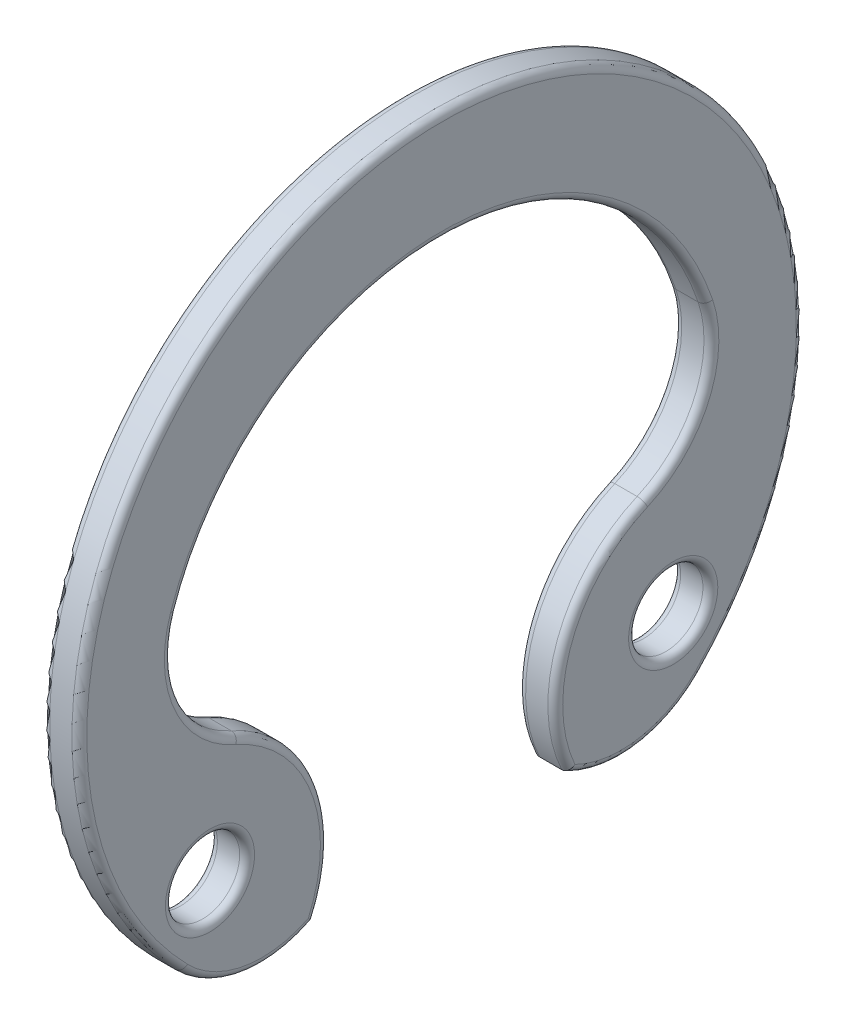
ISO-10303-21;
HEADER;
FILE_DESCRIPTION(('STEP AP214'),'2;1');
FILE_NAME('part.step','',(''),(''),'','','');
FILE_SCHEMA(('AUTOMOTIVE_DESIGN { 1 0 10303 214 1 1 1 1 }'));
ENDSEC;
DATA;
#1=APPLICATION_CONTEXT('core data for automotive mechanical design processes');
#2=APPLICATION_PROTOCOL_DEFINITION('international standard','automotive_design',2000,#1);
#3=PRODUCT_CONTEXT('',#1,'mechanical');
#4=PRODUCT('Part','Part','',(#3));
#5=PRODUCT_RELATED_PRODUCT_CATEGORY('part','',(#4));
#6=PRODUCT_DEFINITION_FORMATION('','',#4);
#7=PRODUCT_DEFINITION_CONTEXT('part definition',#1,'design');
#8=PRODUCT_DEFINITION('design','',#6,#7);
#9=PRODUCT_DEFINITION_SHAPE('','',#8);
#10=(LENGTH_UNIT() NAMED_UNIT(*) SI_UNIT(.MILLI.,.METRE.));
#11=(NAMED_UNIT(*) PLANE_ANGLE_UNIT() SI_UNIT($,.RADIAN.));
#12=(NAMED_UNIT(*) SI_UNIT($,.STERADIAN.) SOLID_ANGLE_UNIT());
#13=UNCERTAINTY_MEASURE_WITH_UNIT(LENGTH_MEASURE(1.E-05),#10,'distance_accuracy_value','');
#14=(GEOMETRIC_REPRESENTATION_CONTEXT(3) GLOBAL_UNCERTAINTY_ASSIGNED_CONTEXT((#13)) GLOBAL_UNIT_ASSIGNED_CONTEXT((#10,
#11,#12)) REPRESENTATION_CONTEXT('',''));
#15=CARTESIAN_POINT('',(0.,0.,0.));
#16=DIRECTION('',(0.,0.,1.));
#17=DIRECTION('',(1.,0.,0.));
#18=AXIS2_PLACEMENT_3D('',#15,#16,#17);
#19=CARTESIAN_POINT('',(1.,-5.67652113609833,-7.06051695329135));
#20=DIRECTION('',(1.,0.,0.));
#21=DIRECTION('',(0.,0.,-1.));
#22=AXIS2_PLACEMENT_3D('',#19,#20,#21);
#23=PLANE('',#22);
#24=CARTESIAN_POINT('',(1.,-5.0126801848678,6.23482456563404));
#25=DIRECTION('',(1.,0.,0.));
#26=DIRECTION('',(0.,0.,-1.));
#27=AXIS2_PLACEMENT_3D('',#24,#25,#26);
#28=CIRCLE('',#27,1.2);
#29=CARTESIAN_POINT('',(1.,-5.0126801848678,5.03482456563404));
#30=VERTEX_POINT('',#29);
#31=EDGE_CURVE('E11',#30,#30,#28,.F.);
#32=ORIENTED_EDGE('',*,*,#31,.T.);
#33=EDGE_LOOP('',(#32));
#34=FACE_BOUND('',#33,.T.);
#35=CARTESIAN_POINT('',(1.,-0.699999999999999,0.));
#36=DIRECTION('',(1.,0.,0.));
#37=DIRECTION('',(0.,0.,-1.));
#38=AXIS2_PLACEMENT_3D('',#35,#36,#37);
#39=CIRCLE('',#38,7.7);
#40=CARTESIAN_POINT('',(1.,1.76449689096355,7.29494722903675));
#41=VERTEX_POINT('',#40);
#42=CARTESIAN_POINT('',(1.,1.76449689096355,-7.29494722903675));
#43=VERTEX_POINT('',#42);
#44=EDGE_CURVE('E61',#41,#43,#39,.F.);
#45=ORIENTED_EDGE('',*,*,#44,.T.);
#46=CARTESIAN_POINT('',(1.,0.740290390822855,-4.26328084813836));
#47=DIRECTION('',(1.,0.,0.));
#48=DIRECTION('',(0.,0.,-1.));
#49=AXIS2_PLACEMENT_3D('',#46,#47,#48);
#50=CIRCLE('',#49,3.2);
#51=CARTESIAN_POINT('',(1.,-2.19310916434111,-5.54201735335115));
#52=VERTEX_POINT('',#51);
#53=EDGE_CURVE('E53',#43,#52,#50,.F.);
#54=ORIENTED_EDGE('',*,*,#53,.T.);
#55=CARTESIAN_POINT('',(1.,-5.67652113609833,-7.06051695329135));
#56=DIRECTION('',(1.,0.,0.));
#57=DIRECTION('',(0.,0.,-1.));
#58=AXIS2_PLACEMENT_3D('',#55,#56,#57);
#59=CIRCLE('',#58,3.8);
#60=CARTESIAN_POINT('',(1.,-7.22066179748076,-3.58839517866053));
#61=VERTEX_POINT('',#60);
#62=EDGE_CURVE('E243',#52,#61,#59,.T.);
#63=ORIENTED_EDGE('',*,*,#62,.T.);
#64=CARTESIAN_POINT('',(1.,-4.71238346623247,-4.83279857506795));
#65=DIRECTION('',(1.,0.,0.));
#66=DIRECTION('',(0.,0.,-1.));
#67=AXIS2_PLACEMENT_3D('',#64,#65,#66);
#68=CIRCLE('',#67,2.8);
#69=CARTESIAN_POINT('',(1.,-6.66714994111409,-6.83751502102206));
#70=VERTEX_POINT('',#69);
#71=EDGE_CURVE('E245',#61,#70,#68,.T.);
#72=ORIENTED_EDGE('',*,*,#71,.T.);
#73=CARTESIAN_POINT('',(1.,0.,0.));
#74=DIRECTION('',(1.,0.,0.));
#75=DIRECTION('',(0.,0.,-1.));
#76=AXIS2_PLACEMENT_3D('',#73,#74,#75);
#77=CIRCLE('',#76,9.55);
#78=CARTESIAN_POINT('',(1.,-6.66714994111409,6.83751502102206));
#79=VERTEX_POINT('',#78);
#80=EDGE_CURVE('E247',#70,#79,#77,.T.);
#81=ORIENTED_EDGE('',*,*,#80,.T.);
#82=CARTESIAN_POINT('',(1.,-4.71238346623247,4.83279857506795));
#83=DIRECTION('',(1.,0.,0.));
#84=DIRECTION('',(0.,0.,-1.));
#85=AXIS2_PLACEMENT_3D('',#82,#83,#84);
#86=CIRCLE('',#85,2.8);
#87=CARTESIAN_POINT('',(1.,-7.22066179748076,3.58839517866053));
#88=VERTEX_POINT('',#87);
#89=EDGE_CURVE('E249',#79,#88,#86,.T.);
#90=ORIENTED_EDGE('',*,*,#89,.T.);
#91=CARTESIAN_POINT('',(1.,-5.67652113609833,7.06051695329135));
#92=DIRECTION('',(1.,0.,0.));
#93=DIRECTION('',(0.,0.,-1.));
#94=AXIS2_PLACEMENT_3D('',#91,#92,#93);
#95=CIRCLE('',#94,3.8);
#96=CARTESIAN_POINT('',(1.,-2.19310916434111,5.54201735335115));
#97=VERTEX_POINT('',#96);
#98=EDGE_CURVE('E251',#88,#97,#95,.T.);
#99=ORIENTED_EDGE('',*,*,#98,.T.);
#100=CARTESIAN_POINT('',(1.,0.740290390822855,4.26328084813836));
#101=DIRECTION('',(1.,0.,0.));
#102=DIRECTION('',(0.,0.,-1.));
#103=AXIS2_PLACEMENT_3D('',#100,#101,#102);
#104=CIRCLE('',#103,3.2);
#105=EDGE_CURVE('E66',#97,#41,#104,.F.);
#106=ORIENTED_EDGE('',*,*,#105,.T.);
#107=EDGE_LOOP('',(#45,#54,#63,#72,#81,#90,#99,#106));
#108=FACE_BOUND('',#107,.T.);
#109=CARTESIAN_POINT('',(1.,-5.0126801848678,-6.23482456563404));
#110=DIRECTION('',(1.,0.,0.));
#111=DIRECTION('',(0.,0.,-1.));
#112=AXIS2_PLACEMENT_3D('',#109,#110,#111);
#113=CIRCLE('',#112,1.2);
#114=CARTESIAN_POINT('',(1.,-5.0126801848678,-7.43482456563404));
#115=VERTEX_POINT('',#114);
#116=EDGE_CURVE('E240',#115,#115,#113,.F.);
#117=ORIENTED_EDGE('',*,*,#116,.T.);
#118=EDGE_LOOP('',(#117));
#119=FACE_BOUND('',#118,.T.);
#120=ADVANCED_FACE('F39',(#34,#108,#119),#23,.T.);
#121=CARTESIAN_POINT('',(0.,-5.67652113609833,-7.06051695329135));
#122=DIRECTION('',(1.,0.,0.));
#123=DIRECTION('',(0.,0.,-1.));
#124=AXIS2_PLACEMENT_3D('',#121,#122,#123);
#125=PLANE('',#124);
#126=CARTESIAN_POINT('',(0.,-5.0126801848678,6.23482456563404));
#127=DIRECTION('',(1.,0.,0.));
#128=DIRECTION('',(0.,0.,-1.));
#129=AXIS2_PLACEMENT_3D('',#126,#127,#128);
#130=CIRCLE('',#129,1.2);
#131=CARTESIAN_POINT('',(0.,-5.0126801848678,5.03482456563404));
#132=VERTEX_POINT('',#131);
#133=EDGE_CURVE('E188',#132,#132,#130,.T.);
#134=ORIENTED_EDGE('',*,*,#133,.T.);
#135=EDGE_LOOP('',(#134));
#136=FACE_BOUND('',#135,.T.);
#137=CARTESIAN_POINT('',(0.,-5.0126801848678,-6.23482456563404));
#138=DIRECTION('',(1.,0.,0.));
#139=DIRECTION('',(0.,0.,-1.));
#140=AXIS2_PLACEMENT_3D('',#137,#138,#139);
#141=CIRCLE('',#140,1.2);
#142=CARTESIAN_POINT('',(0.,-5.0126801848678,-7.43482456563404));
#143=VERTEX_POINT('',#142);
#144=EDGE_CURVE('E185',#143,#143,#141,.T.);
#145=ORIENTED_EDGE('',*,*,#144,.T.);
#146=EDGE_LOOP('',(#145));
#147=FACE_BOUND('',#146,.T.);
#148=CARTESIAN_POINT('',(0.,-5.67652113609833,7.06051695329135));
#149=DIRECTION('',(1.,0.,0.));
#150=DIRECTION('',(0.,0.,-1.));
#151=AXIS2_PLACEMENT_3D('',#148,#149,#150);
#152=CIRCLE('',#151,3.8);
#153=CARTESIAN_POINT('',(0.,-2.19310916434111,5.54201735335115));
#154=VERTEX_POINT('',#153);
#155=CARTESIAN_POINT('',(0.,-7.22066179748076,3.58839517866053));
#156=VERTEX_POINT('',#155);
#157=EDGE_CURVE('E183',#154,#156,#152,.F.);
#158=ORIENTED_EDGE('',*,*,#157,.T.);
#159=CARTESIAN_POINT('',(0.,-4.71238346623247,4.83279857506795));
#160=DIRECTION('',(1.,0.,0.));
#161=DIRECTION('',(0.,0.,-1.));
#162=AXIS2_PLACEMENT_3D('',#159,#160,#161);
#163=CIRCLE('',#162,2.8);
#164=CARTESIAN_POINT('',(0.,-6.66714994111409,6.83751502102206));
#165=VERTEX_POINT('',#164);
#166=EDGE_CURVE('E164',#156,#165,#163,.F.);
#167=ORIENTED_EDGE('',*,*,#166,.T.);
#168=CARTESIAN_POINT('',(0.,0.,0.));
#169=DIRECTION('',(1.,0.,0.));
#170=DIRECTION('',(0.,0.,-1.));
#171=AXIS2_PLACEMENT_3D('',#168,#169,#170);
#172=CIRCLE('',#171,9.55);
#173=CARTESIAN_POINT('',(0.,-6.66714994111409,-6.83751502102206));
#174=VERTEX_POINT('',#173);
#175=EDGE_CURVE('E172',#165,#174,#172,.F.);
#176=ORIENTED_EDGE('',*,*,#175,.T.);
#177=CARTESIAN_POINT('',(0.,-4.71238346623247,-4.83279857506795));
#178=DIRECTION('',(1.,0.,0.));
#179=DIRECTION('',(0.,0.,-1.));
#180=AXIS2_PLACEMENT_3D('',#177,#178,#179);
#181=CIRCLE('',#180,2.8);
#182=CARTESIAN_POINT('',(0.,-7.22066179748076,-3.58839517866053));
#183=VERTEX_POINT('',#182);
#184=EDGE_CURVE('E178',#174,#183,#181,.F.);
#185=ORIENTED_EDGE('',*,*,#184,.T.);
#186=CARTESIAN_POINT('',(0.,-5.67652113609833,-7.06051695329135));
#187=DIRECTION('',(1.,0.,0.));
#188=DIRECTION('',(0.,0.,-1.));
#189=AXIS2_PLACEMENT_3D('',#186,#187,#188);
#190=CIRCLE('',#189,3.8);
#191=CARTESIAN_POINT('',(0.,-2.19310916434111,-5.54201735335115));
#192=VERTEX_POINT('',#191);
#193=EDGE_CURVE('E487',#183,#192,#190,.F.);
#194=ORIENTED_EDGE('',*,*,#193,.T.);
#195=CARTESIAN_POINT('',(0.,0.740290390822855,-4.26328084813836));
#196=DIRECTION('',(1.,0.,0.));
#197=DIRECTION('',(0.,0.,-1.));
#198=AXIS2_PLACEMENT_3D('',#195,#196,#197);
#199=CIRCLE('',#198,3.2);
#200=CARTESIAN_POINT('',(0.,1.76449689096355,-7.29494722903675));
#201=VERTEX_POINT('',#200);
#202=EDGE_CURVE('E462',#192,#201,#199,.T.);
#203=ORIENTED_EDGE('',*,*,#202,.T.);
#204=CARTESIAN_POINT('',(0.,-0.699999999999999,0.));
#205=DIRECTION('',(1.,0.,0.));
#206=DIRECTION('',(0.,0.,-1.));
#207=AXIS2_PLACEMENT_3D('',#204,#205,#206);
#208=CIRCLE('',#207,7.7);
#209=CARTESIAN_POINT('',(0.,1.76449689096355,7.29494722903675));
#210=VERTEX_POINT('',#209);
#211=EDGE_CURVE('E445',#201,#210,#208,.T.);
#212=ORIENTED_EDGE('',*,*,#211,.T.);
#213=CARTESIAN_POINT('',(0.,0.740290390822855,4.26328084813836));
#214=DIRECTION('',(1.,0.,0.));
#215=DIRECTION('',(0.,0.,-1.));
#216=AXIS2_PLACEMENT_3D('',#213,#214,#215);
#217=CIRCLE('',#216,3.2);
#218=EDGE_CURVE('E190',#210,#154,#217,.T.);
#219=ORIENTED_EDGE('',*,*,#218,.T.);
#220=EDGE_LOOP('',(#158,#167,#176,#185,#194,#203,#212,#219));
#221=FACE_BOUND('',#220,.T.);
#222=ADVANCED_FACE('F181',(#136,#147,#221),#125,.F.);
#223=CARTESIAN_POINT('',(1.,-5.67652113609833,-7.06051695329135));
#224=DIRECTION('',(-1.,0.,0.));
#225=DIRECTION('',(0.,0.,1.));
#226=AXIS2_PLACEMENT_3D('',#223,#224,#225);
#227=CYLINDRICAL_SURFACE('',#226,4.);
#228=DIRECTION('',(-1.,0.,0.));
#229=VECTOR('',#228,1.);
#230=CARTESIAN_POINT('',(1.,-2.00977169214337,-5.46209632177536));
#231=LINE('',#230,#229);
#232=CARTESIAN_POINT('',(0.8,-2.00977169214337,-5.46209632177536));
#233=VERTEX_POINT('',#232);
#234=CARTESIAN_POINT('',(0.2,-2.00977169214337,-5.46209632177536));
#235=VERTEX_POINT('',#234);
#236=EDGE_CURVE('E179',#233,#235,#231,.T.);
#237=ORIENTED_EDGE('',*,*,#236,.T.);
#238=CARTESIAN_POINT('',(0.2,-5.67652113609833,-7.06051695329135));
#239=DIRECTION('',(1.,0.,0.));
#240=DIRECTION('',(0.,0.,-1.));
#241=AXIS2_PLACEMENT_3D('',#238,#239,#240);
#242=CIRCLE('',#241,4.);
#243=CARTESIAN_POINT('',(0.2,-7.36699418306113,-3.43528580514475));
#244=VERTEX_POINT('',#243);
#245=EDGE_CURVE('E230',#235,#244,#242,.T.);
#246=ORIENTED_EDGE('',*,*,#245,.T.);
#247=DIRECTION('',(-1.,0.,0.));
#248=VECTOR('',#247,1.);
#249=CARTESIAN_POINT('',(1.,-7.36699418306113,-3.43528580514475));
#250=LINE('',#249,#248);
#251=CARTESIAN_POINT('',(0.8,-7.36699418306113,-3.43528580514475));
#252=VERTEX_POINT('',#251);
#253=EDGE_CURVE('E468',#252,#244,#250,.T.);
#254=ORIENTED_EDGE('',*,*,#253,.F.);
#255=CARTESIAN_POINT('',(0.8,-5.67652113609833,-7.06051695329135));
#256=DIRECTION('',(1.,0.,0.));
#257=DIRECTION('',(0.,0.,-1.));
#258=AXIS2_PLACEMENT_3D('',#255,#256,#257);
#259=CIRCLE('',#258,4.);
#260=EDGE_CURVE('E228',#252,#233,#259,.F.);
#261=ORIENTED_EDGE('',*,*,#260,.T.);
#262=EDGE_LOOP('',(#237,#246,#254,#261));
#263=FACE_BOUND('',#262,.T.);
#264=ADVANCED_FACE('F352',(#263),#227,.T.);
#265=CARTESIAN_POINT('',(1.,0.,0.));
#266=DIRECTION('',(-1.,0.,0.));
#267=DIRECTION('',(0.,0.,1.));
#268=AXIS2_PLACEMENT_3D('',#265,#266,#267);
#269=CYLINDRICAL_SURFACE('',#268,9.75);
#270=DIRECTION('',(-1.,0.,0.));
#271=VECTOR('',#270,1.);
#272=CARTESIAN_POINT('',(1.,-6.80677611789135,-6.98070905287593));
#273=LINE('',#272,#271);
#274=CARTESIAN_POINT('',(0.8,-6.80677611789135,-6.98070905287593));
#275=VERTEX_POINT('',#274);
#276=CARTESIAN_POINT('',(0.2,-6.80677611789135,-6.98070905287593));
#277=VERTEX_POINT('',#276);
#278=EDGE_CURVE('E457',#275,#277,#273,.T.);
#279=ORIENTED_EDGE('',*,*,#278,.T.);
#280=CARTESIAN_POINT('',(0.2,0.,0.));
#281=DIRECTION('',(1.,0.,0.));
#282=DIRECTION('',(0.,0.,-1.));
#283=AXIS2_PLACEMENT_3D('',#280,#281,#282);
#284=CIRCLE('',#283,9.75);
#285=CARTESIAN_POINT('',(0.2,-6.80677611789135,6.98070905287593));
#286=VERTEX_POINT('',#285);
#287=EDGE_CURVE('E238',#277,#286,#284,.T.);
#288=ORIENTED_EDGE('',*,*,#287,.T.);
#289=DIRECTION('',(-1.,0.,0.));
#290=VECTOR('',#289,1.);
#291=CARTESIAN_POINT('',(1.,-6.80677611789135,6.98070905287593));
#292=LINE('',#291,#290);
#293=CARTESIAN_POINT('',(0.8,-6.80677611789135,6.98070905287593));
#294=VERTEX_POINT('',#293);
#295=EDGE_CURVE('E473',#286,#294,#292,.F.);
#296=ORIENTED_EDGE('',*,*,#295,.T.);
#297=CARTESIAN_POINT('',(0.8,0.,0.));
#298=DIRECTION('',(1.,0.,0.));
#299=DIRECTION('',(0.,0.,-1.));
#300=AXIS2_PLACEMENT_3D('',#297,#298,#299);
#301=CIRCLE('',#300,9.75);
#302=EDGE_CURVE('E236',#294,#275,#301,.F.);
#303=ORIENTED_EDGE('',*,*,#302,.T.);
#304=EDGE_LOOP('',(#279,#288,#296,#303));
#305=FACE_BOUND('',#304,.T.);
#306=ADVANCED_FACE('F366',(#305),#269,.T.);
#307=CARTESIAN_POINT('',(1.,-5.67652113609833,7.06051695329135));
#308=DIRECTION('',(-1.,0.,0.));
#309=DIRECTION('',(0.,0.,1.));
#310=AXIS2_PLACEMENT_3D('',#307,#308,#309);
#311=CYLINDRICAL_SURFACE('',#310,4.);
#312=DIRECTION('',(-1.,0.,0.));
#313=VECTOR('',#312,1.);
#314=CARTESIAN_POINT('',(1.,-7.36699418306113,3.43528580514475));
#315=LINE('',#314,#313);
#316=CARTESIAN_POINT('',(0.8,-7.36699418306113,3.43528580514475));
#317=VERTEX_POINT('',#316);
#318=CARTESIAN_POINT('',(0.2,-7.36699418306113,3.43528580514475));
#319=VERTEX_POINT('',#318);
#320=EDGE_CURVE('E300',#317,#319,#315,.T.);
#321=ORIENTED_EDGE('',*,*,#320,.T.);
#322=CARTESIAN_POINT('',(0.2,-5.67652113609833,7.06051695329135));
#323=DIRECTION('',(1.,0.,0.));
#324=DIRECTION('',(0.,0.,-1.));
#325=AXIS2_PLACEMENT_3D('',#322,#323,#324);
#326=CIRCLE('',#325,4.);
#327=CARTESIAN_POINT('',(0.2,-2.00977169214337,5.46209632177535));
#328=VERTEX_POINT('',#327);
#329=EDGE_CURVE('E213',#319,#328,#326,.T.);
#330=ORIENTED_EDGE('',*,*,#329,.T.);
#331=DIRECTION('',(-1.,0.,0.));
#332=VECTOR('',#331,1.);
#333=CARTESIAN_POINT('',(1.,-2.00977169214337,5.46209632177535));
#334=LINE('',#333,#332);
#335=CARTESIAN_POINT('',(0.8,-2.00977169214337,5.46209632177535));
#336=VERTEX_POINT('',#335);
#337=EDGE_CURVE('E482',#328,#336,#334,.F.);
#338=ORIENTED_EDGE('',*,*,#337,.T.);
#339=CARTESIAN_POINT('',(0.8,-5.67652113609833,7.06051695329135));
#340=DIRECTION('',(1.,0.,0.));
#341=DIRECTION('',(0.,0.,-1.));
#342=AXIS2_PLACEMENT_3D('',#339,#340,#341);
#343=CIRCLE('',#342,4.);
#344=EDGE_CURVE('E211',#336,#317,#343,.F.);
#345=ORIENTED_EDGE('',*,*,#344,.T.);
#346=EDGE_LOOP('',(#321,#330,#338,#345));
#347=FACE_BOUND('',#346,.T.);
#348=ADVANCED_FACE('F362',(#347),#311,.T.);
#349=CARTESIAN_POINT('',(1.,-0.699999999999999,0.));
#350=DIRECTION('',(-1.,0.,0.));
#351=DIRECTION('',(0.,0.,1.));
#352=AXIS2_PLACEMENT_3D('',#349,#350,#351);
#353=CYLINDRICAL_SURFACE('',#352,7.5);
#354=DIRECTION('',(-1.,0.,0.));
#355=VECTOR('',#354,1.);
#356=CARTESIAN_POINT('',(1.,1.70048398470476,7.1054680802306));
#357=LINE('',#356,#355);
#358=CARTESIAN_POINT('',(0.8,1.70048398470476,7.1054680802306));
#359=VERTEX_POINT('',#358);
#360=CARTESIAN_POINT('',(0.2,1.70048398470476,7.1054680802306));
#361=VERTEX_POINT('',#360);
#362=EDGE_CURVE('E452',#359,#361,#357,.T.);
#363=ORIENTED_EDGE('',*,*,#362,.T.);
#364=CARTESIAN_POINT('',(0.2,-0.699999999999999,0.));
#365=DIRECTION('',(1.,0.,0.));
#366=DIRECTION('',(0.,0.,-1.));
#367=AXIS2_PLACEMENT_3D('',#364,#365,#366);
#368=CIRCLE('',#367,7.5);
#369=CARTESIAN_POINT('',(0.2,1.70048398470476,-7.1054680802306));
#370=VERTEX_POINT('',#369);
#371=EDGE_CURVE('E221',#361,#370,#368,.F.);
#372=ORIENTED_EDGE('',*,*,#371,.T.);
#373=DIRECTION('',(-1.,0.,0.));
#374=VECTOR('',#373,1.);
#375=CARTESIAN_POINT('',(1.,1.70048398470476,-7.1054680802306));
#376=LINE('',#375,#374);
#377=CARTESIAN_POINT('',(0.8,1.70048398470476,-7.1054680802306));
#378=VERTEX_POINT('',#377);
#379=EDGE_CURVE('E450',#370,#378,#376,.F.);
#380=ORIENTED_EDGE('',*,*,#379,.T.);
#381=CARTESIAN_POINT('',(0.8,-0.699999999999999,0.));
#382=DIRECTION('',(1.,0.,0.));
#383=DIRECTION('',(0.,0.,-1.));
#384=AXIS2_PLACEMENT_3D('',#381,#382,#383);
#385=CIRCLE('',#384,7.5);
#386=EDGE_CURVE('E219',#378,#359,#385,.T.);
#387=ORIENTED_EDGE('',*,*,#386,.T.);
#388=EDGE_LOOP('',(#363,#372,#380,#387));
#389=FACE_BOUND('',#388,.T.);
#390=ADVANCED_FACE('F359',(#389),#353,.F.);
#391=CARTESIAN_POINT('',(1.,-5.0126801848678,-6.23482456563404));
#392=DIRECTION('',(-1.,0.,0.));
#393=DIRECTION('',(0.,0.,1.));
#394=AXIS2_PLACEMENT_3D('',#391,#392,#393);
#395=CYLINDRICAL_SURFACE('',#394,1.);
#396=CARTESIAN_POINT('',(0.2,-5.0126801848678,-6.23482456563404));
#397=DIRECTION('',(1.,0.,0.));
#398=DIRECTION('',(0.,0.,-1.));
#399=AXIS2_PLACEMENT_3D('',#396,#397,#398);
#400=CIRCLE('',#399,1.);
#401=CARTESIAN_POINT('',(0.2,-5.0126801848678,-7.23482456563404));
#402=VERTEX_POINT('',#401);
#403=EDGE_CURVE('E205',#402,#402,#400,.F.);
#404=ORIENTED_EDGE('',*,*,#403,.T.);
#405=EDGE_LOOP('',(#404));
#406=FACE_BOUND('',#405,.T.);
#407=CARTESIAN_POINT('',(0.8,-5.0126801848678,-6.23482456563404));
#408=DIRECTION('',(1.,0.,0.));
#409=DIRECTION('',(0.,0.,-1.));
#410=AXIS2_PLACEMENT_3D('',#407,#408,#409);
#411=CIRCLE('',#410,1.);
#412=CARTESIAN_POINT('',(0.8,-5.0126801848678,-7.23482456563404));
#413=VERTEX_POINT('',#412);
#414=EDGE_CURVE('E202',#413,#413,#411,.T.);
#415=ORIENTED_EDGE('',*,*,#414,.T.);
#416=EDGE_LOOP('',(#415));
#417=FACE_BOUND('',#416,.T.);
#418=ADVANCED_FACE('F356',(#406,#417),#395,.F.);
#419=CARTESIAN_POINT('',(1.,-5.0126801848678,6.23482456563404));
#420=DIRECTION('',(-1.,0.,0.));
#421=DIRECTION('',(0.,0.,1.));
#422=AXIS2_PLACEMENT_3D('',#419,#420,#421);
#423=CYLINDRICAL_SURFACE('',#422,1.);
#424=CARTESIAN_POINT('',(0.2,-5.0126801848678,6.23482456563404));
#425=DIRECTION('',(1.,0.,0.));
#426=DIRECTION('',(0.,0.,-1.));
#427=AXIS2_PLACEMENT_3D('',#424,#425,#426);
#428=CIRCLE('',#427,1.);
#429=CARTESIAN_POINT('',(0.2,-5.0126801848678,5.23482456563404));
#430=VERTEX_POINT('',#429);
#431=EDGE_CURVE('E199',#430,#430,#428,.F.);
#432=ORIENTED_EDGE('',*,*,#431,.T.);
#433=EDGE_LOOP('',(#432));
#434=FACE_BOUND('',#433,.T.);
#435=CARTESIAN_POINT('',(0.8,-5.0126801848678,6.23482456563404));
#436=DIRECTION('',(1.,0.,0.));
#437=DIRECTION('',(0.,0.,-1.));
#438=AXIS2_PLACEMENT_3D('',#435,#436,#437);
#439=CIRCLE('',#438,1.);
#440=CARTESIAN_POINT('',(0.8,-5.0126801848678,5.23482456563404));
#441=VERTEX_POINT('',#440);
#442=EDGE_CURVE('E196',#441,#441,#439,.T.);
#443=ORIENTED_EDGE('',*,*,#442,.T.);
#444=EDGE_LOOP('',(#443));
#445=FACE_BOUND('',#444,.T.);
#446=ADVANCED_FACE('F378',(#434,#445),#423,.F.);
#447=CARTESIAN_POINT('',(1.,-4.71238346623247,-4.83279857506795));
#448=DIRECTION('',(1.,0.,0.));
#449=DIRECTION('',(0.,0.,-1.));
#450=AXIS2_PLACEMENT_3D('',#447,#448,#449);
#451=CYLINDRICAL_SURFACE('',#450,3.);
#452=ORIENTED_EDGE('',*,*,#253,.T.);
#453=CARTESIAN_POINT('',(0.2,-4.71238346623247,-4.83279857506795));
#454=DIRECTION('',(1.,0.,0.));
#455=DIRECTION('',(0.,0.,-1.));
#456=AXIS2_PLACEMENT_3D('',#453,#454,#455);
#457=CIRCLE('',#456,3.);
#458=EDGE_CURVE('E234',#244,#277,#457,.T.);
#459=ORIENTED_EDGE('',*,*,#458,.T.);
#460=ORIENTED_EDGE('',*,*,#278,.F.);
#461=CARTESIAN_POINT('',(0.8,-4.71238346623247,-4.83279857506795));
#462=DIRECTION('',(1.,0.,0.));
#463=DIRECTION('',(0.,0.,-1.));
#464=AXIS2_PLACEMENT_3D('',#461,#462,#463);
#465=CIRCLE('',#464,3.);
#466=EDGE_CURVE('E232',#275,#252,#465,.F.);
#467=ORIENTED_EDGE('',*,*,#466,.T.);
#468=EDGE_LOOP('',(#452,#459,#460,#467));
#469=FACE_BOUND('',#468,.T.);
#470=ADVANCED_FACE('F374',(#469),#451,.T.);
#471=CARTESIAN_POINT('',(1.,-4.71238346623247,4.83279857506795));
#472=DIRECTION('',(1.,0.,0.));
#473=DIRECTION('',(0.,0.,-1.));
#474=AXIS2_PLACEMENT_3D('',#471,#472,#473);
#475=CYLINDRICAL_SURFACE('',#474,3.);
#476=ORIENTED_EDGE('',*,*,#295,.F.);
#477=CARTESIAN_POINT('',(0.2,-4.71238346623247,4.83279857506795));
#478=DIRECTION('',(1.,0.,0.));
#479=DIRECTION('',(0.,0.,-1.));
#480=AXIS2_PLACEMENT_3D('',#477,#478,#479);
#481=CIRCLE('',#480,3.);
#482=EDGE_CURVE('E166',#286,#319,#481,.T.);
#483=ORIENTED_EDGE('',*,*,#482,.T.);
#484=ORIENTED_EDGE('',*,*,#320,.F.);
#485=CARTESIAN_POINT('',(0.8,-4.71238346623247,4.83279857506795));
#486=DIRECTION('',(1.,0.,0.));
#487=DIRECTION('',(0.,0.,-1.));
#488=AXIS2_PLACEMENT_3D('',#485,#486,#487);
#489=CIRCLE('',#488,3.);
#490=EDGE_CURVE('E208',#317,#294,#489,.F.);
#491=ORIENTED_EDGE('',*,*,#490,.T.);
#492=EDGE_LOOP('',(#476,#483,#484,#491));
#493=FACE_BOUND('',#492,.T.);
#494=ADVANCED_FACE('F377',(#493),#475,.T.);
#495=CARTESIAN_POINT('',(1.,0.740290390822855,4.26328084813836));
#496=DIRECTION('',(-1.,0.,0.));
#497=DIRECTION('',(0.,0.,1.));
#498=AXIS2_PLACEMENT_3D('',#495,#496,#497);
#499=CYLINDRICAL_SURFACE('',#498,3.);
#500=ORIENTED_EDGE('',*,*,#337,.F.);
#501=CARTESIAN_POINT('',(0.2,0.740290390822855,4.26328084813836));
#502=DIRECTION('',(1.,0.,0.));
#503=DIRECTION('',(0.,0.,-1.));
#504=AXIS2_PLACEMENT_3D('',#501,#502,#503);
#505=CIRCLE('',#504,3.);
#506=EDGE_CURVE('E217',#328,#361,#505,.F.);
#507=ORIENTED_EDGE('',*,*,#506,.T.);
#508=ORIENTED_EDGE('',*,*,#362,.F.);
#509=CARTESIAN_POINT('',(0.8,0.740290390822855,4.26328084813836));
#510=DIRECTION('',(1.,0.,0.));
#511=DIRECTION('',(0.,0.,-1.));
#512=AXIS2_PLACEMENT_3D('',#509,#510,#511);
#513=CIRCLE('',#512,3.);
#514=EDGE_CURVE('E215',#359,#336,#513,.T.);
#515=ORIENTED_EDGE('',*,*,#514,.T.);
#516=EDGE_LOOP('',(#500,#507,#508,#515));
#517=FACE_BOUND('',#516,.T.);
#518=ADVANCED_FACE('F382',(#517),#499,.F.);
#519=CARTESIAN_POINT('',(1.,0.740290390822855,-4.26328084813836));
#520=DIRECTION('',(-1.,0.,0.));
#521=DIRECTION('',(0.,0.,1.));
#522=AXIS2_PLACEMENT_3D('',#519,#520,#521);
#523=CYLINDRICAL_SURFACE('',#522,3.);
#524=ORIENTED_EDGE('',*,*,#379,.F.);
#525=CARTESIAN_POINT('',(0.2,0.740290390822855,-4.26328084813836));
#526=DIRECTION('',(1.,0.,0.));
#527=DIRECTION('',(0.,0.,-1.));
#528=AXIS2_PLACEMENT_3D('',#525,#526,#527);
#529=CIRCLE('',#528,3.);
#530=EDGE_CURVE('E226',#370,#235,#529,.F.);
#531=ORIENTED_EDGE('',*,*,#530,.T.);
#532=ORIENTED_EDGE('',*,*,#236,.F.);
#533=CARTESIAN_POINT('',(0.8,0.740290390822855,-4.26328084813836));
#534=DIRECTION('',(1.,0.,0.));
#535=DIRECTION('',(0.,0.,-1.));
#536=AXIS2_PLACEMENT_3D('',#533,#534,#535);
#537=CIRCLE('',#536,3.);
#538=EDGE_CURVE('E223',#233,#378,#537,.T.);
#539=ORIENTED_EDGE('',*,*,#538,.T.);
#540=EDGE_LOOP('',(#524,#531,#532,#539));
#541=FACE_BOUND('',#540,.T.);
#542=ADVANCED_FACE('F386',(#541),#523,.F.);
#543=CARTESIAN_POINT('',(0.2,-5.0126801848678,6.23482456563404));
#544=DIRECTION('',(1.,0.,0.));
#545=DIRECTION('',(0.,0.,-1.));
#546=AXIS2_PLACEMENT_3D('',#543,#544,#545);
#547=TOROIDAL_SURFACE('',#546,1.2,0.2);
#548=ORIENTED_EDGE('',*,*,#431,.F.);
#549=EDGE_LOOP('',(#548));
#550=FACE_BOUND('',#549,.T.);
#551=ORIENTED_EDGE('',*,*,#133,.F.);
#552=EDGE_LOOP('',(#551));
#553=FACE_BOUND('',#552,.T.);
#554=ADVANCED_FACE('F390',(#550,#553),#547,.T.);
#555=CARTESIAN_POINT('',(0.2,-5.0126801848678,-6.23482456563404));
#556=DIRECTION('',(1.,0.,0.));
#557=DIRECTION('',(0.,0.,-1.));
#558=AXIS2_PLACEMENT_3D('',#555,#556,#557);
#559=TOROIDAL_SURFACE('',#558,1.2,0.2);
#560=ORIENTED_EDGE('',*,*,#403,.F.);
#561=EDGE_LOOP('',(#560));
#562=FACE_BOUND('',#561,.T.);
#563=ORIENTED_EDGE('',*,*,#144,.F.);
#564=EDGE_LOOP('',(#563));
#565=FACE_BOUND('',#564,.T.);
#566=ADVANCED_FACE('F393',(#562,#565),#559,.T.);
#567=CARTESIAN_POINT('',(0.2,0.740290390822855,-4.26328084813836));
#568=DIRECTION('',(1.,0.,0.));
#569=DIRECTION('',(0.,0.,-1.));
#570=AXIS2_PLACEMENT_3D('',#567,#568,#569);
#571=TOROIDAL_SURFACE('',#570,3.2,0.2);
#572=CARTESIAN_POINT('',(0.2,-2.19310916434111,-5.54201735335115));
#573=DIRECTION('',(0.,-0.399605157878998,0.916687360988741));
#574=DIRECTION('',(0.,-0.916687360988741,-0.399605157878998));
#575=AXIS2_PLACEMENT_3D('',#572,#573,#574);
#576=CIRCLE('',#575,0.2);
#577=EDGE_CURVE('E294',#235,#192,#576,.T.);
#578=ORIENTED_EDGE('',*,*,#577,.F.);
#579=ORIENTED_EDGE('',*,*,#530,.F.);
#580=CARTESIAN_POINT('',(0.2,1.76449689096355,-7.29494722903675));
#581=DIRECTION('',(0.,0.947395744030747,0.320064531293968));
#582=DIRECTION('',(0.,-0.320064531293968,0.947395744030747));
#583=AXIS2_PLACEMENT_3D('',#580,#581,#582);
#584=CIRCLE('',#583,0.2);
#585=EDGE_CURVE('E297',#201,#370,#584,.T.);
#586=ORIENTED_EDGE('',*,*,#585,.F.);
#587=ORIENTED_EDGE('',*,*,#202,.F.);
#588=EDGE_LOOP('',(#578,#579,#586,#587));
#589=FACE_BOUND('',#588,.T.);
#590=ADVANCED_FACE('F396',(#589),#571,.T.);
#591=CARTESIAN_POINT('',(0.2,-0.699999999999999,0.));
#592=DIRECTION('',(1.,0.,0.));
#593=DIRECTION('',(0.,0.,-1.));
#594=AXIS2_PLACEMENT_3D('',#591,#592,#593);
#595=TOROIDAL_SURFACE('',#594,7.7,0.2);
#596=ORIENTED_EDGE('',*,*,#585,.T.);
#597=ORIENTED_EDGE('',*,*,#371,.F.);
#598=CARTESIAN_POINT('',(0.2,1.76449689096355,7.29494722903675));
#599=DIRECTION('',(0.,-0.947395744030747,0.320064531293968));
#600=DIRECTION('',(0.,-0.320064531293968,-0.947395744030747));
#601=AXIS2_PLACEMENT_3D('',#598,#599,#600);
#602=CIRCLE('',#601,0.2);
#603=EDGE_CURVE('E290',#210,#361,#602,.T.);
#604=ORIENTED_EDGE('',*,*,#603,.F.);
#605=ORIENTED_EDGE('',*,*,#211,.F.);
#606=EDGE_LOOP('',(#596,#597,#604,#605));
#607=FACE_BOUND('',#606,.T.);
#608=ADVANCED_FACE('F401',(#607),#595,.T.);
#609=CARTESIAN_POINT('',(0.2,-5.67652113609833,-7.06051695329135));
#610=DIRECTION('',(1.,0.,0.));
#611=DIRECTION('',(0.,0.,-1.));
#612=AXIS2_PLACEMENT_3D('',#609,#610,#611);
#613=TOROIDAL_SURFACE('',#612,3.8,0.2);
#614=ORIENTED_EDGE('',*,*,#577,.T.);
#615=ORIENTED_EDGE('',*,*,#193,.F.);
#616=CARTESIAN_POINT('',(0.2,-7.36699418306113,-3.43528580514475));
#617=CARTESIAN_POINT('',(0.189180375899773,-7.36700227311266,-3.43527721709877));
#618=CARTESIAN_POINT('',(0.178366851306995,-7.36635561864176,-3.43595594612942));
#619=CARTESIAN_POINT('',(0.157074807906333,-7.36381513563019,-3.43862191381995));
#620=CARTESIAN_POINT('',(0.146595626656706,-7.36192395759211,-3.44060637162528));
#621=CARTESIAN_POINT('',(0.126246688148736,-7.35695628824544,-3.44581815473954));
#622=CARTESIAN_POINT('',(0.116376925364054,-7.35387980768726,-3.44904546877605));
#623=CARTESIAN_POINT('',(0.0975039807333349,-7.34664982847446,-3.45662803280648));
#624=CARTESIAN_POINT('',(0.0885009420050147,-7.34249615236489,-3.46098346864469));
#625=CARTESIAN_POINT('',(0.0713999520950806,-7.3331465874261,-3.47078415771831));
#626=CARTESIAN_POINT('',(0.0633251610697309,-7.32793052037236,-3.47625050547054));
#627=CARTESIAN_POINT('',(0.0484842470099642,-7.31667317015812,-3.48804362614301));
#628=CARTESIAN_POINT('',(0.0417185812919638,-7.3106315998777,-3.49437069843018));
#629=CARTESIAN_POINT('',(0.0293285266145433,-7.29757569803557,-3.50803781649506));
#630=CARTESIAN_POINT('',(0.0237778958472534,-7.2905278770149,-3.5154126471722));
#631=CARTESIAN_POINT('',(0.01437095552718,-7.27590858876746,-3.53070277344227));
#632=CARTESIAN_POINT('',(0.0105145791644388,-7.26833714220258,-3.53861804770953));
#633=CARTESIAN_POINT('',(0.00517932772998916,-7.2544912909632,-3.55308509474534));
#634=CARTESIAN_POINT('',(0.00337195831760543,-7.24827664749976,-3.55957597288232));
#635=CARTESIAN_POINT('',(0.000868775337229182,-7.23574601335065,-3.57265798164207));
#636=CARTESIAN_POINT('',(0.000171009464521215,-7.22943022046106,-3.57924891554));
#637=CARTESIAN_POINT('',(9.22923807167453E-06,-7.22229562833602,-3.58669106234611));
#638=CARTESIAN_POINT('',(-2.31971873428929E-08,-7.22147867004719,-3.58754318949176));
#639=CARTESIAN_POINT('',(0.,-7.22066179748076,-3.58839517866053));
#640=B_SPLINE_CURVE_WITH_KNOTS('',3,(#616,#617,#618,#619,#620,#621,#622,#623,#624,#625,#626,
#627,#628,#629,#630,#631,#632,#633,#634,#635,#636,#637,#638,#639),.UNSPECIFIED.,.F.,.F.,(4,2,2,
2,2,2,2,2,2,2,2,4),(0.,0.0324089823587937,0.0647491646619221,0.0970890536541317,
0.129434273640337,0.162463350848327,0.195503945347326,0.230192572567,0.264879831778557,
0.292315325949533,0.319702494802458,0.323243884974016),.UNSPECIFIED.);
#641=EDGE_CURVE('E283',#244,#183,#640,.T.);
#642=ORIENTED_EDGE('',*,*,#641,.F.);
#643=ORIENTED_EDGE('',*,*,#245,.F.);
#644=EDGE_LOOP('',(#614,#615,#642,#643));
#645=FACE_BOUND('',#644,.T.);
#646=ADVANCED_FACE('F279',(#645),#613,.T.);
#647=CARTESIAN_POINT('',(0.2,0.740290390822855,4.26328084813836));
#648=DIRECTION('',(1.,0.,0.));
#649=DIRECTION('',(0.,0.,-1.));
#650=AXIS2_PLACEMENT_3D('',#647,#648,#649);
#651=TOROIDAL_SURFACE('',#650,3.2,0.2);
#652=ORIENTED_EDGE('',*,*,#603,.T.);
#653=ORIENTED_EDGE('',*,*,#506,.F.);
#654=CARTESIAN_POINT('',(0.2,-2.19310916434111,5.54201735335115));
#655=DIRECTION('',(0.,-0.399605157878997,-0.916687360988741));
#656=DIRECTION('',(0.,0.916687360988741,-0.399605157878997));
#657=AXIS2_PLACEMENT_3D('',#654,#655,#656);
#658=CIRCLE('',#657,0.2);
#659=EDGE_CURVE('E291',#154,#328,#658,.T.);
#660=ORIENTED_EDGE('',*,*,#659,.F.);
#661=ORIENTED_EDGE('',*,*,#218,.F.);
#662=EDGE_LOOP('',(#652,#653,#660,#661));
#663=FACE_BOUND('',#662,.T.);
#664=ADVANCED_FACE('F277',(#663),#651,.T.);
#665=CARTESIAN_POINT('',(0.2,-4.71238346623247,-4.83279857506795));
#666=DIRECTION('',(1.,0.,0.));
#667=DIRECTION('',(0.,0.,-1.));
#668=AXIS2_PLACEMENT_3D('',#665,#666,#667);
#669=TOROIDAL_SURFACE('',#668,2.8,0.2);
#670=ORIENTED_EDGE('',*,*,#641,.T.);
#671=ORIENTED_EDGE('',*,*,#184,.F.);
#672=CARTESIAN_POINT('',(0.2,-6.66714994111409,-6.83751502102206));
#673=DIRECTION('',(0.,0.715970159269327,-0.698130883886292));
#674=DIRECTION('',(0.,0.698130883886292,0.715970159269327));
#675=AXIS2_PLACEMENT_3D('',#672,#673,#674);
#676=CIRCLE('',#675,0.2);
#677=EDGE_CURVE('E175',#277,#174,#676,.T.);
#678=ORIENTED_EDGE('',*,*,#677,.F.);
#679=ORIENTED_EDGE('',*,*,#458,.F.);
#680=EDGE_LOOP('',(#670,#671,#678,#679));
#681=FACE_BOUND('',#680,.T.);
#682=ADVANCED_FACE('F273',(#681),#669,.T.);
#683=CARTESIAN_POINT('',(0.2,-5.67652113609833,7.06051695329135));
#684=DIRECTION('',(1.,0.,0.));
#685=DIRECTION('',(0.,0.,-1.));
#686=AXIS2_PLACEMENT_3D('',#683,#684,#685);
#687=TOROIDAL_SURFACE('',#686,3.8,0.2);
#688=ORIENTED_EDGE('',*,*,#659,.T.);
#689=ORIENTED_EDGE('',*,*,#329,.F.);
#690=CARTESIAN_POINT('',(0.2,-7.36699418306113,3.43528580514475));
#691=CARTESIAN_POINT('',(0.189180375899773,-7.36700227311266,3.43527721709877));
#692=CARTESIAN_POINT('',(0.178366851306996,-7.36635561864176,3.43595594612941));
#693=CARTESIAN_POINT('',(0.157074807906333,-7.36381513563019,3.43862191381995));
#694=CARTESIAN_POINT('',(0.146595626656706,-7.36192395759211,3.44060637162528));
#695=CARTESIAN_POINT('',(0.126246688148736,-7.35695628824544,3.44581815473954));
#696=CARTESIAN_POINT('',(0.116376925364054,-7.35387980768726,3.44904546877605));
#697=CARTESIAN_POINT('',(0.0975039807333351,-7.34664982847446,3.45662803280648));
#698=CARTESIAN_POINT('',(0.088500942005015,-7.34249615236489,3.46098346864468));
#699=CARTESIAN_POINT('',(0.0713999520950808,-7.3331465874261,3.47078415771831));
#700=CARTESIAN_POINT('',(0.0633251610697311,-7.32793052037236,3.47625050547054));
#701=CARTESIAN_POINT('',(0.0484842470099643,-7.31667317015812,3.48804362614301));
#702=CARTESIAN_POINT('',(0.041718581291964,-7.3106315998777,3.49437069843018));
#703=CARTESIAN_POINT('',(0.0293285266145435,-7.29757569803557,3.50803781649506));
#704=CARTESIAN_POINT('',(0.0237778958472536,-7.2905278770149,3.5154126471722));
#705=CARTESIAN_POINT('',(0.0143709555271801,-7.27590858876746,3.53070277344227));
#706=CARTESIAN_POINT('',(0.0105145791644389,-7.26833714220258,3.53861804770953));
#707=CARTESIAN_POINT('',(0.0051793277299892,-7.2544912909632,3.55308509474534));
#708=CARTESIAN_POINT('',(0.0033719583176054,-7.24827664749976,3.55957597288232));
#709=CARTESIAN_POINT('',(0.000868775337229127,-7.23574601335065,3.57265798164207));
#710=CARTESIAN_POINT('',(0.000171009464521199,-7.22943022046106,3.57924891554));
#711=CARTESIAN_POINT('',(9.22923807167679E-06,-7.22229562833602,3.58669106234611));
#712=CARTESIAN_POINT('',(-2.31971873395034E-08,-7.22147867004719,3.58754318949176));
#713=CARTESIAN_POINT('',(0.,-7.22066179748076,3.58839517866053));
#714=B_SPLINE_CURVE_WITH_KNOTS('',3,(#690,#691,#692,#693,#694,#695,#696,#697,#698,#699,#700,
#701,#702,#703,#704,#705,#706,#707,#708,#709,#710,#711,#712,#713),.UNSPECIFIED.,.F.,.F.,(4,2,2,
2,2,2,2,2,2,2,2,4),(0.,0.0324089823587934,0.0647491646619219,0.0970890536541314,
0.129434273640337,0.162463350848327,0.195503945347327,0.230192572567,0.264879831778557,
0.292315325949533,0.319702494802459,0.323243884974016),.UNSPECIFIED.);
#715=EDGE_CURVE('E169',#156,#319,#714,.F.);
#716=ORIENTED_EDGE('',*,*,#715,.F.);
#717=ORIENTED_EDGE('',*,*,#157,.F.);
#718=EDGE_LOOP('',(#688,#689,#716,#717));
#719=FACE_BOUND('',#718,.T.);
#720=ADVANCED_FACE('F264',(#719),#687,.T.);
#721=CARTESIAN_POINT('',(0.2,0.,0.));
#722=DIRECTION('',(1.,0.,0.));
#723=DIRECTION('',(0.,0.,-1.));
#724=AXIS2_PLACEMENT_3D('',#721,#722,#723);
#725=TOROIDAL_SURFACE('',#724,9.55,0.2);
#726=ORIENTED_EDGE('',*,*,#677,.T.);
#727=ORIENTED_EDGE('',*,*,#175,.F.);
#728=CARTESIAN_POINT('',(0.2,-6.66714994111409,6.83751502102206));
#729=DIRECTION('',(0.,-0.715970159269327,-0.698130883886292));
#730=DIRECTION('',(0.,0.698130883886292,-0.715970159269327));
#731=AXIS2_PLACEMENT_3D('',#728,#729,#730);
#732=CIRCLE('',#731,0.2);
#733=EDGE_CURVE('E160',#286,#165,#732,.T.);
#734=ORIENTED_EDGE('',*,*,#733,.F.);
#735=ORIENTED_EDGE('',*,*,#287,.F.);
#736=EDGE_LOOP('',(#726,#727,#734,#735));
#737=FACE_BOUND('',#736,.T.);
#738=ADVANCED_FACE('F173',(#737),#725,.T.);
#739=CARTESIAN_POINT('',(0.2,-4.71238346623247,4.83279857506795));
#740=DIRECTION('',(1.,0.,0.));
#741=DIRECTION('',(0.,0.,-1.));
#742=AXIS2_PLACEMENT_3D('',#739,#740,#741);
#743=TOROIDAL_SURFACE('',#742,2.8,0.2);
#744=ORIENTED_EDGE('',*,*,#715,.T.);
#745=ORIENTED_EDGE('',*,*,#482,.F.);
#746=ORIENTED_EDGE('',*,*,#733,.T.);
#747=ORIENTED_EDGE('',*,*,#166,.F.);
#748=EDGE_LOOP('',(#744,#745,#746,#747));
#749=FACE_BOUND('',#748,.T.);
#750=ADVANCED_FACE('F162',(#749),#743,.T.);
#751=CARTESIAN_POINT('',(0.8,-5.0126801848678,6.23482456563404));
#752=DIRECTION('',(1.,0.,0.));
#753=DIRECTION('',(0.,0.,-1.));
#754=AXIS2_PLACEMENT_3D('',#751,#752,#753);
#755=TOROIDAL_SURFACE('',#754,1.2,0.2);
#756=ORIENTED_EDGE('',*,*,#31,.F.);
#757=EDGE_LOOP('',(#756));
#758=FACE_BOUND('',#757,.T.);
#759=ORIENTED_EDGE('',*,*,#442,.F.);
#760=EDGE_LOOP('',(#759));
#761=FACE_BOUND('',#760,.T.);
#762=ADVANCED_FACE('F270',(#758,#761),#755,.T.);
#763=CARTESIAN_POINT('',(0.8,-4.71238346623247,4.83279857506795));
#764=DIRECTION('',(1.,0.,0.));
#765=DIRECTION('',(0.,0.,-1.));
#766=AXIS2_PLACEMENT_3D('',#763,#764,#765);
#767=TOROIDAL_SURFACE('',#766,2.8,0.2);
#768=CARTESIAN_POINT('',(0.8,-6.66714994111409,6.83751502102206));
#769=DIRECTION('',(0.,0.715970159269327,0.698130883886292));
#770=DIRECTION('',(0.,-0.698130883886292,0.715970159269327));
#771=AXIS2_PLACEMENT_3D('',#768,#769,#770);
#772=CIRCLE('',#771,0.2);
#773=EDGE_CURVE('E504',#294,#79,#772,.T.);
#774=ORIENTED_EDGE('',*,*,#773,.F.);
#775=ORIENTED_EDGE('',*,*,#490,.F.);
#776=CARTESIAN_POINT('',(0.8,-7.36699418306113,3.43528580514475));
#777=CARTESIAN_POINT('',(0.810819624100227,-7.36700227311266,3.43527721709877));
#778=CARTESIAN_POINT('',(0.821633148693005,-7.36635561864176,3.43595594612941));
#779=CARTESIAN_POINT('',(0.842925192093667,-7.36381513563019,3.43862191381995));
#780=CARTESIAN_POINT('',(0.853404373343294,-7.36192395759211,3.44060637162528));
#781=CARTESIAN_POINT('',(0.873753311851264,-7.35695628824544,3.44581815473954));
#782=CARTESIAN_POINT('',(0.883623074635946,-7.35387980768726,3.44904546877605));
#783=CARTESIAN_POINT('',(0.902496019266665,-7.34664982847446,3.45662803280648));
#784=CARTESIAN_POINT('',(0.911499057994985,-7.34249615236489,3.46098346864468));
#785=CARTESIAN_POINT('',(0.928600047904919,-7.3331465874261,3.47078415771831));
#786=CARTESIAN_POINT('',(0.936674838930269,-7.32793052037236,3.47625050547054));
#787=CARTESIAN_POINT('',(0.951515752990036,-7.31667317015812,3.48804362614301));
#788=CARTESIAN_POINT('',(0.958281418708036,-7.3106315998777,3.49437069843018));
#789=CARTESIAN_POINT('',(0.970671473385457,-7.29757569803557,3.50803781649506));
#790=CARTESIAN_POINT('',(0.976222104152747,-7.2905278770149,3.5154126471722));
#791=CARTESIAN_POINT('',(0.98562904447282,-7.27590858876746,3.53070277344227));
#792=CARTESIAN_POINT('',(0.989485420835561,-7.26833714220258,3.53861804770953));
#793=CARTESIAN_POINT('',(0.994820672270011,-7.2544912909632,3.55308509474534));
#794=CARTESIAN_POINT('',(0.996628041682395,-7.24827664749976,3.55957597288232));
#795=CARTESIAN_POINT('',(0.999131224662771,-7.23574601335065,3.57265798164207));
#796=CARTESIAN_POINT('',(0.999828990535479,-7.22943022046106,3.57924891554));
#797=CARTESIAN_POINT('',(0.999990770761928,-7.22229562833602,3.58669106234611));
#798=CARTESIAN_POINT('',(1.00000002319719,-7.22147867004719,3.58754318949176));
#799=CARTESIAN_POINT('',(1.,-7.22066179748076,3.58839517866053));
#800=B_SPLINE_CURVE_WITH_KNOTS('',3,(#776,#777,#778,#779,#780,#781,#782,#783,#784,#785,#786,
#787,#788,#789,#790,#791,#792,#793,#794,#795,#796,#797,#798,#799),.UNSPECIFIED.,.F.,.F.,(4,2,2,
2,2,2,2,2,2,2,2,4),(0.,0.0324089823587936,0.064749164661922,0.0970890536541314,
0.129434273640337,0.162463350848327,0.195503945347327,0.230192572567,0.264879831778557,
0.292315325949533,0.319702494802459,0.323243884974016),.UNSPECIFIED.);
#801=EDGE_CURVE('E43',#88,#317,#800,.F.);
#802=ORIENTED_EDGE('',*,*,#801,.F.);
#803=ORIENTED_EDGE('',*,*,#89,.F.);
#804=EDGE_LOOP('',(#774,#775,#802,#803));
#805=FACE_BOUND('',#804,.T.);
#806=ADVANCED_FACE('F336',(#805),#767,.T.);
#807=CARTESIAN_POINT('',(0.8,-5.67652113609833,7.06051695329135));
#808=DIRECTION('',(1.,0.,0.));
#809=DIRECTION('',(0.,0.,-1.));
#810=AXIS2_PLACEMENT_3D('',#807,#808,#809);
#811=TOROIDAL_SURFACE('',#810,3.8,0.2);
#812=ORIENTED_EDGE('',*,*,#801,.T.);
#813=ORIENTED_EDGE('',*,*,#344,.F.);
#814=CARTESIAN_POINT('',(0.8,-2.19310916434111,5.54201735335115));
#815=DIRECTION('',(0.,0.399605157878997,0.916687360988741));
#816=DIRECTION('',(0.,-0.916687360988741,0.399605157878997));
#817=AXIS2_PLACEMENT_3D('',#814,#815,#816);
#818=CIRCLE('',#817,0.2);
#819=EDGE_CURVE('E500',#97,#336,#818,.T.);
#820=ORIENTED_EDGE('',*,*,#819,.F.);
#821=ORIENTED_EDGE('',*,*,#98,.F.);
#822=EDGE_LOOP('',(#812,#813,#820,#821));
#823=FACE_BOUND('',#822,.T.);
#824=ADVANCED_FACE('F334',(#823),#811,.T.);
#825=CARTESIAN_POINT('',(0.8,0.,0.));
#826=DIRECTION('',(1.,0.,0.));
#827=DIRECTION('',(0.,0.,-1.));
#828=AXIS2_PLACEMENT_3D('',#825,#826,#827);
#829=TOROIDAL_SURFACE('',#828,9.55,0.2);
#830=ORIENTED_EDGE('',*,*,#773,.T.);
#831=ORIENTED_EDGE('',*,*,#80,.F.);
#832=CARTESIAN_POINT('',(0.8,-6.66714994111409,-6.83751502102206));
#833=DIRECTION('',(0.,-0.715970159269327,0.698130883886292));
#834=DIRECTION('',(0.,-0.698130883886292,-0.715970159269327));
#835=AXIS2_PLACEMENT_3D('',#832,#833,#834);
#836=CIRCLE('',#835,0.2);
#837=EDGE_CURVE('E505',#275,#70,#836,.T.);
#838=ORIENTED_EDGE('',*,*,#837,.F.);
#839=ORIENTED_EDGE('',*,*,#302,.F.);
#840=EDGE_LOOP('',(#830,#831,#838,#839));
#841=FACE_BOUND('',#840,.T.);
#842=ADVANCED_FACE('F331',(#841),#829,.T.);
#843=CARTESIAN_POINT('',(0.8,0.740290390822855,4.26328084813836));
#844=DIRECTION('',(1.,0.,0.));
#845=DIRECTION('',(0.,0.,-1.));
#846=AXIS2_PLACEMENT_3D('',#843,#844,#845);
#847=TOROIDAL_SURFACE('',#846,3.2,0.2);
#848=ORIENTED_EDGE('',*,*,#819,.T.);
#849=ORIENTED_EDGE('',*,*,#514,.F.);
#850=CARTESIAN_POINT('',(0.8,1.76449689096355,7.29494722903675));
#851=DIRECTION('',(0.,0.947395744030747,-0.320064531293968));
#852=DIRECTION('',(0.,0.320064531293968,0.947395744030747));
#853=AXIS2_PLACEMENT_3D('',#850,#851,#852);
#854=CIRCLE('',#853,0.2);
#855=EDGE_CURVE('E314',#41,#359,#854,.T.);
#856=ORIENTED_EDGE('',*,*,#855,.F.);
#857=ORIENTED_EDGE('',*,*,#105,.F.);
#858=EDGE_LOOP('',(#848,#849,#856,#857));
#859=FACE_BOUND('',#858,.T.);
#860=ADVANCED_FACE('F324',(#859),#847,.T.);
#861=CARTESIAN_POINT('',(0.8,-4.71238346623247,-4.83279857506795));
#862=DIRECTION('',(1.,0.,0.));
#863=DIRECTION('',(0.,0.,-1.));
#864=AXIS2_PLACEMENT_3D('',#861,#862,#863);
#865=TOROIDAL_SURFACE('',#864,2.8,0.2);
#866=ORIENTED_EDGE('',*,*,#837,.T.);
#867=ORIENTED_EDGE('',*,*,#71,.F.);
#868=CARTESIAN_POINT('',(0.8,-7.36699418306113,-3.43528580514475));
#869=CARTESIAN_POINT('',(0.810819624100227,-7.36700227311266,-3.43527721709877));
#870=CARTESIAN_POINT('',(0.821633148693005,-7.36635561864176,-3.43595594612942));
#871=CARTESIAN_POINT('',(0.842925192093667,-7.36381513563019,-3.43862191381995));
#872=CARTESIAN_POINT('',(0.853404373343294,-7.36192395759211,-3.44060637162528));
#873=CARTESIAN_POINT('',(0.873753311851264,-7.35695628824544,-3.44581815473954));
#874=CARTESIAN_POINT('',(0.883623074635946,-7.35387980768726,-3.44904546877605));
#875=CARTESIAN_POINT('',(0.902496019266665,-7.34664982847446,-3.45662803280648));
#876=CARTESIAN_POINT('',(0.911499057994985,-7.34249615236489,-3.46098346864469));
#877=CARTESIAN_POINT('',(0.928600047904919,-7.3331465874261,-3.47078415771831));
#878=CARTESIAN_POINT('',(0.936674838930269,-7.32793052037236,-3.47625050547054));
#879=CARTESIAN_POINT('',(0.951515752990036,-7.31667317015812,-3.48804362614301));
#880=CARTESIAN_POINT('',(0.958281418708036,-7.3106315998777,-3.49437069843018));
#881=CARTESIAN_POINT('',(0.970671473385457,-7.29757569803557,-3.50803781649506));
#882=CARTESIAN_POINT('',(0.976222104152746,-7.2905278770149,-3.5154126471722));
#883=CARTESIAN_POINT('',(0.98562904447282,-7.27590858876746,-3.53070277344227));
#884=CARTESIAN_POINT('',(0.989485420835561,-7.26833714220259,-3.53861804770953));
#885=CARTESIAN_POINT('',(0.994820672270011,-7.2544912909632,-3.55308509474534));
#886=CARTESIAN_POINT('',(0.996628041682395,-7.24827664749976,-3.55957597288232));
#887=CARTESIAN_POINT('',(0.999131224662771,-7.23574601335065,-3.57265798164207));
#888=CARTESIAN_POINT('',(0.999828990535479,-7.22943022046106,-3.57924891554));
#889=CARTESIAN_POINT('',(0.999990770761928,-7.22229562833602,-3.58669106234611));
#890=CARTESIAN_POINT('',(1.00000002319719,-7.22147867004719,-3.58754318949176));
#891=CARTESIAN_POINT('',(1.,-7.22066179748076,-3.58839517866053));
#892=B_SPLINE_CURVE_WITH_KNOTS('',3,(#868,#869,#870,#871,#872,#873,#874,#875,#876,#877,#878,
#879,#880,#881,#882,#883,#884,#885,#886,#887,#888,#889,#890,#891),.UNSPECIFIED.,.F.,.F.,(4,2,2,
2,2,2,2,2,2,2,2,4),(0.,0.0324089823587936,0.0647491646619221,0.0970890536541317,
0.129434273640337,0.162463350848327,0.195503945347326,0.230192572566999,0.264879831778556,
0.292315325949532,0.319702494802459,0.323243884974016),.UNSPECIFIED.);
#893=EDGE_CURVE('E305',#252,#61,#892,.T.);
#894=ORIENTED_EDGE('',*,*,#893,.F.);
#895=ORIENTED_EDGE('',*,*,#466,.F.);
#896=EDGE_LOOP('',(#866,#867,#894,#895));
#897=FACE_BOUND('',#896,.T.);
#898=ADVANCED_FACE('F319',(#897),#865,.T.);
#899=CARTESIAN_POINT('',(0.8,-0.699999999999999,0.));
#900=DIRECTION('',(1.,0.,0.));
#901=DIRECTION('',(0.,0.,-1.));
#902=AXIS2_PLACEMENT_3D('',#899,#900,#901);
#903=TOROIDAL_SURFACE('',#902,7.7,0.2);
#904=ORIENTED_EDGE('',*,*,#855,.T.);
#905=ORIENTED_EDGE('',*,*,#386,.F.);
#906=CARTESIAN_POINT('',(0.8,1.76449689096355,-7.29494722903675));
#907=DIRECTION('',(0.,-0.947395744030747,-0.320064531293968));
#908=DIRECTION('',(0.,0.320064531293968,-0.947395744030747));
#909=AXIS2_PLACEMENT_3D('',#906,#907,#908);
#910=CIRCLE('',#909,0.2);
#911=EDGE_CURVE('E303',#43,#378,#910,.T.);
#912=ORIENTED_EDGE('',*,*,#911,.F.);
#913=ORIENTED_EDGE('',*,*,#44,.F.);
#914=EDGE_LOOP('',(#904,#905,#912,#913));
#915=FACE_BOUND('',#914,.T.);
#916=ADVANCED_FACE('F323',(#915),#903,.T.);
#917=CARTESIAN_POINT('',(0.8,-5.67652113609833,-7.06051695329135));
#918=DIRECTION('',(1.,0.,0.));
#919=DIRECTION('',(0.,0.,-1.));
#920=AXIS2_PLACEMENT_3D('',#917,#918,#919);
#921=TOROIDAL_SURFACE('',#920,3.8,0.2);
#922=ORIENTED_EDGE('',*,*,#893,.T.);
#923=ORIENTED_EDGE('',*,*,#62,.F.);
#924=CARTESIAN_POINT('',(0.8,-2.19310916434111,-5.54201735335115));
#925=DIRECTION('',(0.,0.399605157878998,-0.916687360988741));
#926=DIRECTION('',(0.,0.916687360988741,0.399605157878998));
#927=AXIS2_PLACEMENT_3D('',#924,#925,#926);
#928=CIRCLE('',#927,0.2);
#929=EDGE_CURVE('E301',#233,#52,#928,.T.);
#930=ORIENTED_EDGE('',*,*,#929,.F.);
#931=ORIENTED_EDGE('',*,*,#260,.F.);
#932=EDGE_LOOP('',(#922,#923,#930,#931));
#933=FACE_BOUND('',#932,.T.);
#934=ADVANCED_FACE('F316',(#933),#921,.T.);
#935=CARTESIAN_POINT('',(0.8,0.740290390822855,-4.26328084813836));
#936=DIRECTION('',(1.,0.,0.));
#937=DIRECTION('',(0.,0.,-1.));
#938=AXIS2_PLACEMENT_3D('',#935,#936,#937);
#939=TOROIDAL_SURFACE('',#938,3.2,0.2);
#940=ORIENTED_EDGE('',*,*,#911,.T.);
#941=ORIENTED_EDGE('',*,*,#538,.F.);
#942=ORIENTED_EDGE('',*,*,#929,.T.);
#943=ORIENTED_EDGE('',*,*,#53,.F.);
#944=EDGE_LOOP('',(#940,#941,#942,#943));
#945=FACE_BOUND('',#944,.T.);
#946=ADVANCED_FACE('F414',(#945),#939,.T.);
#947=CARTESIAN_POINT('',(0.8,-5.0126801848678,-6.23482456563404));
#948=DIRECTION('',(1.,0.,0.));
#949=DIRECTION('',(0.,0.,-1.));
#950=AXIS2_PLACEMENT_3D('',#947,#948,#949);
#951=TOROIDAL_SURFACE('',#950,1.2,0.2);
#952=ORIENTED_EDGE('',*,*,#116,.F.);
#953=EDGE_LOOP('',(#952));
#954=FACE_BOUND('',#953,.T.);
#955=ORIENTED_EDGE('',*,*,#414,.F.);
#956=EDGE_LOOP('',(#955));
#957=FACE_BOUND('',#956,.T.);
#958=ADVANCED_FACE('F41',(#954,#957),#951,.T.);
#959=CLOSED_SHELL('',(#120,#222,#264,#306,#348,#390,#418,#446,#470,#494,#518,#542,#554,#566,
#590,#608,#646,#664,#682,#720,#738,#750,#762,#806,#824,#842,#860,#898,#916,#934,#946,#958));
#960=MANIFOLD_SOLID_BREP('B2',#959);
#961=ADVANCED_BREP_SHAPE_REPRESENTATION('',(#18,#960),#14);
#962=SHAPE_DEFINITION_REPRESENTATION(#9,#961);
ENDSEC;
END-ISO-10303-21;
